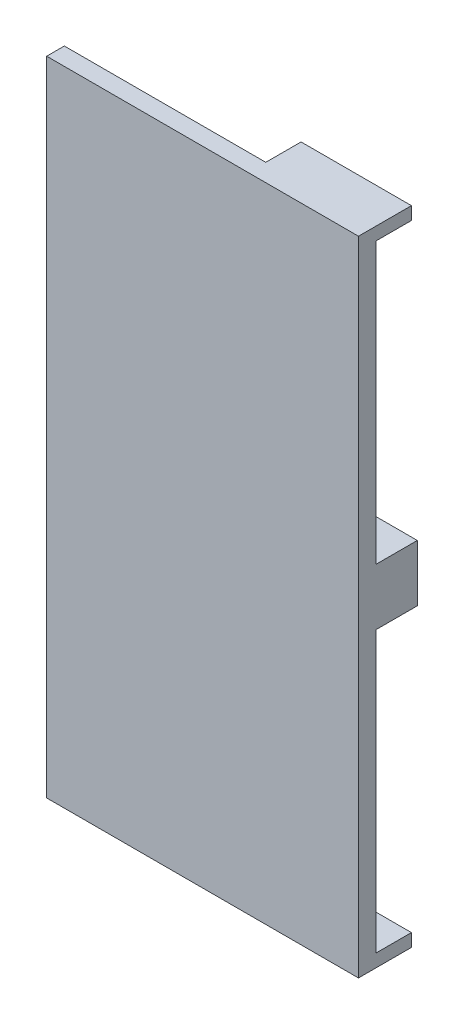
ISO-10303-21;
HEADER;
FILE_DESCRIPTION(('STEP AP214'),'2;1');
FILE_NAME('part.step','',(''),(''),'','','');
FILE_SCHEMA(('AUTOMOTIVE_DESIGN { 1 0 10303 214 1 1 1 1 }'));
ENDSEC;
DATA;
#1=APPLICATION_CONTEXT('core data for automotive mechanical design processes');
#2=APPLICATION_PROTOCOL_DEFINITION('international standard','automotive_design',2000,#1);
#3=PRODUCT_CONTEXT('',#1,'mechanical');
#4=PRODUCT('Part','Part','',(#3));
#5=PRODUCT_RELATED_PRODUCT_CATEGORY('part','',(#4));
#6=PRODUCT_DEFINITION_FORMATION('','',#4);
#7=PRODUCT_DEFINITION_CONTEXT('part definition',#1,'design');
#8=PRODUCT_DEFINITION('design','',#6,#7);
#9=PRODUCT_DEFINITION_SHAPE('','',#8);
#10=(LENGTH_UNIT() NAMED_UNIT(*) SI_UNIT(.MILLI.,.METRE.));
#11=(NAMED_UNIT(*) PLANE_ANGLE_UNIT() SI_UNIT($,.RADIAN.));
#12=(NAMED_UNIT(*) SI_UNIT($,.STERADIAN.) SOLID_ANGLE_UNIT());
#13=UNCERTAINTY_MEASURE_WITH_UNIT(LENGTH_MEASURE(1.E-05),#10,'distance_accuracy_value','');
#14=(GEOMETRIC_REPRESENTATION_CONTEXT(3) GLOBAL_UNCERTAINTY_ASSIGNED_CONTEXT((#13)) GLOBAL_UNIT_ASSIGNED_CONTEXT((#10,
#11,#12)) REPRESENTATION_CONTEXT('',''));
#15=CARTESIAN_POINT('',(0.,0.,0.));
#16=DIRECTION('',(0.,0.,1.));
#17=DIRECTION('',(1.,0.,0.));
#18=AXIS2_PLACEMENT_3D('',#15,#16,#17);
#19=CARTESIAN_POINT('',(0.,0.,0.));
#20=DIRECTION('',(0.,0.,1.));
#21=DIRECTION('',(1.,0.,0.));
#22=AXIS2_PLACEMENT_3D('',#19,#20,#21);
#23=PLANE('',#22);
#24=DIRECTION('',(-1.,0.,0.));
#25=VECTOR('',#24,1.);
#26=CARTESIAN_POINT('',(32.7375583752302,31.5854403836247,0.));
#27=LINE('',#26,#25);
#28=CARTESIAN_POINT('',(42.2573819600676,31.5854403836247,0.));
#29=VERTEX_POINT('',#28);
#30=CARTESIAN_POINT('',(32.7375583752302,31.5854403836247,0.));
#31=VERTEX_POINT('',#30);
#32=EDGE_CURVE('E533',#29,#31,#27,.T.);
#33=ORIENTED_EDGE('',*,*,#32,.F.);
#34=DIRECTION('',(0.,1.,0.));
#35=VECTOR('',#34,1.);
#36=CARTESIAN_POINT('',(42.2573819600676,61.2919093984213,0.));
#37=LINE('',#36,#35);
#38=CARTESIAN_POINT('',(42.2573819600676,7.78544038362487,0.));
#39=VERTEX_POINT('',#38);
#40=EDGE_CURVE('E182',#39,#29,#37,.T.);
#41=ORIENTED_EDGE('',*,*,#40,.F.);
#42=DIRECTION('',(-1.,0.,0.));
#43=VECTOR('',#42,1.);
#44=CARTESIAN_POINT('',(42.2573819600676,7.78544038362487,0.));
#45=LINE('',#44,#43);
#46=CARTESIAN_POINT('',(32.8785387402206,7.78544038362487,0.));
#47=VERTEX_POINT('',#46);
#48=EDGE_CURVE('E216',#39,#47,#45,.T.);
#49=ORIENTED_EDGE('',*,*,#48,.T.);
#50=DIRECTION('',(0.,-1.,0.));
#51=VECTOR('',#50,1.);
#52=CARTESIAN_POINT('',(32.8785387402206,6.69190939842128,0.));
#53=LINE('',#52,#51);
#54=CARTESIAN_POINT('',(32.8785387402206,6.69190939842128,0.));
#55=VERTEX_POINT('',#54);
#56=EDGE_CURVE('E211',#47,#55,#53,.T.);
#57=ORIENTED_EDGE('',*,*,#56,.T.);
#58=DIRECTION('',(1.,0.,0.));
#59=VECTOR('',#58,1.);
#60=CARTESIAN_POINT('',(15.7573819600676,6.69190939842127,0.));
#61=LINE('',#60,#59);
#62=CARTESIAN_POINT('',(15.7573819600676,6.69190939842127,0.));
#63=VERTEX_POINT('',#62);
#64=EDGE_CURVE('E313',#63,#55,#61,.T.);
#65=ORIENTED_EDGE('',*,*,#64,.F.);
#66=DIRECTION('',(0.,-1.,0.));
#67=VECTOR('',#66,1.);
#68=CARTESIAN_POINT('',(15.7573819600676,61.2919093984213,0.));
#69=LINE('',#68,#67);
#70=CARTESIAN_POINT('',(15.7573819600676,27.4919093984213,0.));
#71=VERTEX_POINT('',#70);
#72=EDGE_CURVE('E274',#71,#63,#69,.T.);
#73=ORIENTED_EDGE('',*,*,#72,.F.);
#74=DIRECTION('',(-1.,0.,0.));
#75=VECTOR('',#74,1.);
#76=CARTESIAN_POINT('',(23.7285916275448,27.4919093984213,0.));
#77=LINE('',#76,#75);
#78=CARTESIAN_POINT('',(23.7285916275448,27.4919093984213,0.));
#79=VERTEX_POINT('',#78);
#80=EDGE_CURVE('E59',#79,#71,#77,.T.);
#81=ORIENTED_EDGE('',*,*,#80,.F.);
#82=DIRECTION('',(0.,-1.,0.));
#83=VECTOR('',#82,1.);
#84=CARTESIAN_POINT('',(23.7285916275448,40.4919093984213,0.));
#85=LINE('',#84,#83);
#86=CARTESIAN_POINT('',(23.7285916275448,40.4919093984213,0.));
#87=VERTEX_POINT('',#86);
#88=EDGE_CURVE('E194',#87,#79,#85,.T.);
#89=ORIENTED_EDGE('',*,*,#88,.F.);
#90=DIRECTION('',(1.,0.,0.));
#91=VECTOR('',#90,1.);
#92=CARTESIAN_POINT('',(23.7285916275448,40.4919093984213,0.));
#93=LINE('',#92,#91);
#94=CARTESIAN_POINT('',(15.7573819600676,40.4919093984213,0.));
#95=VERTEX_POINT('',#94);
#96=EDGE_CURVE('E184',#95,#87,#93,.T.);
#97=ORIENTED_EDGE('',*,*,#96,.F.);
#98=CARTESIAN_POINT('',(15.7573819600676,61.2919093984213,0.));
#99=VERTEX_POINT('',#98);
#100=EDGE_CURVE('E270',#99,#95,#69,.T.);
#101=ORIENTED_EDGE('',*,*,#100,.F.);
#102=DIRECTION('',(-1.,0.,0.));
#103=VECTOR('',#102,1.);
#104=CARTESIAN_POINT('',(42.2573819600676,61.2919093984213,0.));
#105=LINE('',#104,#103);
#106=CARTESIAN_POINT('',(32.8785387402206,61.2919093984213,0.));
#107=VERTEX_POINT('',#106);
#108=EDGE_CURVE('E261',#107,#99,#105,.T.);
#109=ORIENTED_EDGE('',*,*,#108,.F.);
#110=DIRECTION('',(0.,1.,0.));
#111=VECTOR('',#110,1.);
#112=CARTESIAN_POINT('',(32.8785387402206,61.2919093984213,0.));
#113=LINE('',#112,#111);
#114=CARTESIAN_POINT('',(32.8785387402206,60.1983784132177,0.));
#115=VERTEX_POINT('',#114);
#116=EDGE_CURVE('E240',#115,#107,#113,.T.);
#117=ORIENTED_EDGE('',*,*,#116,.F.);
#118=DIRECTION('',(-1.,0.,0.));
#119=VECTOR('',#118,1.);
#120=CARTESIAN_POINT('',(42.2573819600676,60.1983784132177,0.));
#121=LINE('',#120,#119);
#122=CARTESIAN_POINT('',(42.2573819600676,60.1983784132177,0.));
#123=VERTEX_POINT('',#122);
#124=EDGE_CURVE('E235',#123,#115,#121,.T.);
#125=ORIENTED_EDGE('',*,*,#124,.F.);
#126=CARTESIAN_POINT('',(42.2573819600676,36.3983784132179,0.));
#127=VERTEX_POINT('',#126);
#128=EDGE_CURVE('E37',#127,#123,#37,.T.);
#129=ORIENTED_EDGE('',*,*,#128,.F.);
#130=DIRECTION('',(1.,0.,0.));
#131=VECTOR('',#130,1.);
#132=CARTESIAN_POINT('',(32.7375583752302,36.3983784132179,0.));
#133=LINE('',#132,#131);
#134=CARTESIAN_POINT('',(32.7375583752302,36.3983784132179,0.));
#135=VERTEX_POINT('',#134);
#136=EDGE_CURVE('E178',#135,#127,#133,.T.);
#137=ORIENTED_EDGE('',*,*,#136,.F.);
#138=DIRECTION('',(0.,1.,0.));
#139=VECTOR('',#138,1.);
#140=CARTESIAN_POINT('',(32.7375583752302,36.3983784132179,0.));
#141=LINE('',#140,#139);
#142=EDGE_CURVE('E531',#31,#135,#141,.T.);
#143=ORIENTED_EDGE('',*,*,#142,.F.);
#144=EDGE_LOOP('',(#33,#41,#49,#57,#65,#73,#81,#89,#97,#101,#109,#117,#125,#129,#137,#143));
#145=FACE_BOUND('',#144,.T.);
#146=ADVANCED_FACE('F33',(#145),#23,.F.);
#147=CARTESIAN_POINT('',(42.2573819600676,61.2919093984213,1.5));
#148=DIRECTION('',(-1.,0.,0.));
#149=DIRECTION('',(0.,-1.,0.));
#150=AXIS2_PLACEMENT_3D('',#147,#148,#149);
#151=PLANE('',#150);
#152=DIRECTION('',(0.,0.,-1.));
#153=VECTOR('',#152,1.);
#154=CARTESIAN_POINT('',(42.2573819600676,6.69190939842127,1.5));
#155=LINE('',#154,#153);
#156=CARTESIAN_POINT('',(42.2573819600676,6.69190939842127,1.5));
#157=VERTEX_POINT('',#156);
#158=CARTESIAN_POINT('',(42.2573819600676,6.69190939842128,-3.));
#159=VERTEX_POINT('',#158);
#160=EDGE_CURVE('E310',#157,#159,#155,.T.);
#161=ORIENTED_EDGE('',*,*,#160,.T.);
#162=DIRECTION('',(0.,1.,0.));
#163=VECTOR('',#162,1.);
#164=CARTESIAN_POINT('',(42.2573819600676,6.69190939842128,-3.));
#165=LINE('',#164,#163);
#166=CARTESIAN_POINT('',(42.2573819600676,7.78544038362487,-3.));
#167=VERTEX_POINT('',#166);
#168=EDGE_CURVE('E212',#159,#167,#165,.T.);
#169=ORIENTED_EDGE('',*,*,#168,.T.);
#170=DIRECTION('',(0.,0.,1.));
#171=VECTOR('',#170,1.);
#172=CARTESIAN_POINT('',(42.2573819600676,7.78544038362487,-3.));
#173=LINE('',#172,#171);
#174=EDGE_CURVE('E225',#167,#39,#173,.T.);
#175=ORIENTED_EDGE('',*,*,#174,.T.);
#176=ORIENTED_EDGE('',*,*,#40,.T.);
#177=DIRECTION('',(0.,0.,1.));
#178=VECTOR('',#177,1.);
#179=CARTESIAN_POINT('',(42.2573819600676,31.5854403836247,-3.5));
#180=LINE('',#179,#178);
#181=CARTESIAN_POINT('',(42.2573819600676,31.5854403836247,-3.5));
#182=VERTEX_POINT('',#181);
#183=EDGE_CURVE('E166',#182,#29,#180,.T.);
#184=ORIENTED_EDGE('',*,*,#183,.F.);
#185=DIRECTION('',(0.,-1.,0.));
#186=VECTOR('',#185,1.);
#187=CARTESIAN_POINT('',(42.2573819600676,36.3983784132179,-3.5));
#188=LINE('',#187,#186);
#189=CARTESIAN_POINT('',(42.2573819600676,36.3983784132179,-3.5));
#190=VERTEX_POINT('',#189);
#191=EDGE_CURVE('E173',#190,#182,#188,.T.);
#192=ORIENTED_EDGE('',*,*,#191,.F.);
#193=DIRECTION('',(0.,0.,1.));
#194=VECTOR('',#193,1.);
#195=CARTESIAN_POINT('',(42.2573819600676,36.3983784132179,-3.5));
#196=LINE('',#195,#194);
#197=EDGE_CURVE('E51',#190,#127,#196,.T.);
#198=ORIENTED_EDGE('',*,*,#197,.T.);
#199=ORIENTED_EDGE('',*,*,#128,.T.);
#200=DIRECTION('',(0.,0.,1.));
#201=VECTOR('',#200,1.);
#202=CARTESIAN_POINT('',(42.2573819600676,60.1983784132177,-3.));
#203=LINE('',#202,#201);
#204=CARTESIAN_POINT('',(42.2573819600676,60.1983784132177,-3.));
#205=VERTEX_POINT('',#204);
#206=EDGE_CURVE('E279',#205,#123,#203,.T.);
#207=ORIENTED_EDGE('',*,*,#206,.F.);
#208=DIRECTION('',(0.,-1.,0.));
#209=VECTOR('',#208,1.);
#210=CARTESIAN_POINT('',(42.2573819600676,61.2919093984213,-3.));
#211=LINE('',#210,#209);
#212=CARTESIAN_POINT('',(42.2573819600676,61.2919093984213,-3.));
#213=VERTEX_POINT('',#212);
#214=EDGE_CURVE('E236',#213,#205,#211,.T.);
#215=ORIENTED_EDGE('',*,*,#214,.F.);
#216=DIRECTION('',(0.,0.,-1.));
#217=VECTOR('',#216,1.);
#218=CARTESIAN_POINT('',(42.2573819600676,61.2919093984213,1.5));
#219=LINE('',#218,#217);
#220=CARTESIAN_POINT('',(42.2573819600676,61.2919093984213,1.5));
#221=VERTEX_POINT('',#220);
#222=EDGE_CURVE('E11',#221,#213,#219,.T.);
#223=ORIENTED_EDGE('',*,*,#222,.F.);
#224=DIRECTION('',(0.,1.,0.));
#225=VECTOR('',#224,1.);
#226=CARTESIAN_POINT('',(42.2573819600676,61.2919093984213,1.5));
#227=LINE('',#226,#225);
#228=EDGE_CURVE('E315',#157,#221,#227,.T.);
#229=ORIENTED_EDGE('',*,*,#228,.F.);
#230=EDGE_LOOP('',(#161,#169,#175,#176,#184,#192,#198,#199,#207,#215,#223,#229));
#231=FACE_BOUND('',#230,.T.);
#232=ADVANCED_FACE('F35',(#231),#151,.F.);
#233=CARTESIAN_POINT('',(42.2573819600676,61.2919093984213,1.5));
#234=DIRECTION('',(0.,-1.,0.));
#235=DIRECTION('',(1.,0.,0.));
#236=AXIS2_PLACEMENT_3D('',#233,#234,#235);
#237=PLANE('',#236);
#238=ORIENTED_EDGE('',*,*,#222,.T.);
#239=DIRECTION('',(1.,0.,0.));
#240=VECTOR('',#239,1.);
#241=CARTESIAN_POINT('',(42.2573819600676,61.2919093984213,-3.));
#242=LINE('',#241,#240);
#243=CARTESIAN_POINT('',(32.8785387402206,61.2919093984213,-3.));
#244=VERTEX_POINT('',#243);
#245=EDGE_CURVE('E244',#244,#213,#242,.T.);
#246=ORIENTED_EDGE('',*,*,#245,.F.);
#247=DIRECTION('',(0.,0.,1.));
#248=VECTOR('',#247,1.);
#249=CARTESIAN_POINT('',(32.8785387402206,61.2919093984213,-3.));
#250=LINE('',#249,#248);
#251=EDGE_CURVE('E247',#244,#107,#250,.T.);
#252=ORIENTED_EDGE('',*,*,#251,.T.);
#253=ORIENTED_EDGE('',*,*,#108,.T.);
#254=DIRECTION('',(0.,0.,-1.));
#255=VECTOR('',#254,1.);
#256=CARTESIAN_POINT('',(15.7573819600676,61.2919093984213,1.5));
#257=LINE('',#256,#255);
#258=CARTESIAN_POINT('',(15.7573819600676,61.2919093984213,1.5));
#259=VERTEX_POINT('',#258);
#260=EDGE_CURVE('E43',#259,#99,#257,.T.);
#261=ORIENTED_EDGE('',*,*,#260,.F.);
#262=DIRECTION('',(-1.,0.,0.));
#263=VECTOR('',#262,1.);
#264=CARTESIAN_POINT('',(42.2573819600676,61.2919093984213,1.5));
#265=LINE('',#264,#263);
#266=EDGE_CURVE('E319',#221,#259,#265,.T.);
#267=ORIENTED_EDGE('',*,*,#266,.F.);
#268=EDGE_LOOP('',(#238,#246,#252,#253,#261,#267));
#269=FACE_BOUND('',#268,.T.);
#270=ADVANCED_FACE('F300',(#269),#237,.F.);
#271=CARTESIAN_POINT('',(15.7573819600676,61.2919093984213,1.5));
#272=DIRECTION('',(1.,0.,0.));
#273=DIRECTION('',(0.,1.,0.));
#274=AXIS2_PLACEMENT_3D('',#271,#272,#273);
#275=PLANE('',#274);
#276=ORIENTED_EDGE('',*,*,#100,.T.);
#277=DIRECTION('',(0.,0.,1.));
#278=VECTOR('',#277,1.);
#279=CARTESIAN_POINT('',(15.7573819600676,40.4919093984213,-3.5));
#280=LINE('',#279,#278);
#281=CARTESIAN_POINT('',(15.7573819600676,40.4919093984213,-3.5));
#282=VERTEX_POINT('',#281);
#283=EDGE_CURVE('E207',#282,#95,#280,.T.);
#284=ORIENTED_EDGE('',*,*,#283,.F.);
#285=DIRECTION('',(0.,1.,0.));
#286=VECTOR('',#285,1.);
#287=CARTESIAN_POINT('',(15.7573819600676,27.4919093984213,-3.5));
#288=LINE('',#287,#286);
#289=CARTESIAN_POINT('',(15.7573819600676,27.4919093984213,-3.5));
#290=VERTEX_POINT('',#289);
#291=EDGE_CURVE('E193',#290,#282,#288,.T.);
#292=ORIENTED_EDGE('',*,*,#291,.F.);
#293=DIRECTION('',(0.,0.,1.));
#294=VECTOR('',#293,1.);
#295=CARTESIAN_POINT('',(15.7573819600676,27.4919093984213,-3.5));
#296=LINE('',#295,#294);
#297=EDGE_CURVE('E209',#290,#71,#296,.T.);
#298=ORIENTED_EDGE('',*,*,#297,.T.);
#299=ORIENTED_EDGE('',*,*,#72,.T.);
#300=DIRECTION('',(0.,0.,-1.));
#301=VECTOR('',#300,1.);
#302=CARTESIAN_POINT('',(15.7573819600676,6.69190939842127,1.5));
#303=LINE('',#302,#301);
#304=CARTESIAN_POINT('',(15.7573819600676,6.69190939842127,1.5));
#305=VERTEX_POINT('',#304);
#306=EDGE_CURVE('E308',#305,#63,#303,.T.);
#307=ORIENTED_EDGE('',*,*,#306,.F.);
#308=DIRECTION('',(0.,-1.,0.));
#309=VECTOR('',#308,1.);
#310=CARTESIAN_POINT('',(15.7573819600676,61.2919093984213,1.5));
#311=LINE('',#310,#309);
#312=EDGE_CURVE('E307',#259,#305,#311,.T.);
#313=ORIENTED_EDGE('',*,*,#312,.F.);
#314=ORIENTED_EDGE('',*,*,#260,.T.);
#315=EDGE_LOOP('',(#276,#284,#292,#298,#299,#307,#313,#314));
#316=FACE_BOUND('',#315,.T.);
#317=ADVANCED_FACE('F304',(#316),#275,.F.);
#318=CARTESIAN_POINT('',(15.7573819600676,6.69190939842127,1.5));
#319=DIRECTION('',(0.,1.,0.));
#320=DIRECTION('',(-1.,0.,0.));
#321=AXIS2_PLACEMENT_3D('',#318,#319,#320);
#322=PLANE('',#321);
#323=ORIENTED_EDGE('',*,*,#64,.T.);
#324=DIRECTION('',(0.,0.,1.));
#325=VECTOR('',#324,1.);
#326=CARTESIAN_POINT('',(32.8785387402206,6.69190939842128,-3.));
#327=LINE('',#326,#325);
#328=CARTESIAN_POINT('',(32.8785387402206,6.69190939842128,-3.));
#329=VERTEX_POINT('',#328);
#330=EDGE_CURVE('E233',#329,#55,#327,.T.);
#331=ORIENTED_EDGE('',*,*,#330,.F.);
#332=DIRECTION('',(1.,0.,0.));
#333=VECTOR('',#332,1.);
#334=CARTESIAN_POINT('',(42.2573819600676,6.69190939842128,-3.));
#335=LINE('',#334,#333);
#336=EDGE_CURVE('E215',#329,#159,#335,.T.);
#337=ORIENTED_EDGE('',*,*,#336,.T.);
#338=ORIENTED_EDGE('',*,*,#160,.F.);
#339=DIRECTION('',(1.,0.,0.));
#340=VECTOR('',#339,1.);
#341=CARTESIAN_POINT('',(15.7573819600676,6.69190939842127,1.5));
#342=LINE('',#341,#340);
#343=EDGE_CURVE('E265',#305,#157,#342,.T.);
#344=ORIENTED_EDGE('',*,*,#343,.F.);
#345=ORIENTED_EDGE('',*,*,#306,.T.);
#346=EDGE_LOOP('',(#323,#331,#337,#338,#344,#345));
#347=FACE_BOUND('',#346,.T.);
#348=ADVANCED_FACE('F322',(#347),#322,.F.);
#349=CARTESIAN_POINT('',(0.,0.,1.5));
#350=DIRECTION('',(0.,0.,1.));
#351=DIRECTION('',(1.,0.,0.));
#352=AXIS2_PLACEMENT_3D('',#349,#350,#351);
#353=PLANE('',#352);
#354=ORIENTED_EDGE('',*,*,#228,.T.);
#355=ORIENTED_EDGE('',*,*,#266,.T.);
#356=ORIENTED_EDGE('',*,*,#312,.T.);
#357=ORIENTED_EDGE('',*,*,#343,.T.);
#358=EDGE_LOOP('',(#354,#355,#356,#357));
#359=FACE_BOUND('',#358,.T.);
#360=ADVANCED_FACE('F338',(#359),#353,.T.);
#361=CARTESIAN_POINT('',(42.2573819600676,60.1983784132177,-3.));
#362=DIRECTION('',(0.,1.,0.));
#363=DIRECTION('',(0.,0.,1.));
#364=AXIS2_PLACEMENT_3D('',#361,#362,#363);
#365=PLANE('',#364);
#366=ORIENTED_EDGE('',*,*,#124,.T.);
#367=DIRECTION('',(0.,0.,1.));
#368=VECTOR('',#367,1.);
#369=CARTESIAN_POINT('',(32.8785387402206,60.1983784132177,-3.));
#370=LINE('',#369,#368);
#371=CARTESIAN_POINT('',(32.8785387402206,60.1983784132177,-3.));
#372=VERTEX_POINT('',#371);
#373=EDGE_CURVE('E250',#372,#115,#370,.T.);
#374=ORIENTED_EDGE('',*,*,#373,.F.);
#375=DIRECTION('',(-1.,0.,0.));
#376=VECTOR('',#375,1.);
#377=CARTESIAN_POINT('',(42.2573819600676,60.1983784132177,-3.));
#378=LINE('',#377,#376);
#379=EDGE_CURVE('E239',#205,#372,#378,.T.);
#380=ORIENTED_EDGE('',*,*,#379,.F.);
#381=ORIENTED_EDGE('',*,*,#206,.T.);
#382=EDGE_LOOP('',(#366,#374,#380,#381));
#383=FACE_BOUND('',#382,.T.);
#384=ADVANCED_FACE('F289',(#383),#365,.F.);
#385=CARTESIAN_POINT('',(32.8785387402206,61.2919093984213,-3.));
#386=DIRECTION('',(1.,0.,0.));
#387=DIRECTION('',(0.,0.,-1.));
#388=AXIS2_PLACEMENT_3D('',#385,#386,#387);
#389=PLANE('',#388);
#390=ORIENTED_EDGE('',*,*,#116,.T.);
#391=ORIENTED_EDGE('',*,*,#251,.F.);
#392=DIRECTION('',(0.,1.,0.));
#393=VECTOR('',#392,1.);
#394=CARTESIAN_POINT('',(32.8785387402206,61.2919093984213,-3.));
#395=LINE('',#394,#393);
#396=EDGE_CURVE('E242',#372,#244,#395,.T.);
#397=ORIENTED_EDGE('',*,*,#396,.F.);
#398=ORIENTED_EDGE('',*,*,#373,.T.);
#399=EDGE_LOOP('',(#390,#391,#397,#398));
#400=FACE_BOUND('',#399,.T.);
#401=ADVANCED_FACE('F287',(#400),#389,.F.);
#402=CARTESIAN_POINT('',(0.,0.,-3.));
#403=DIRECTION('',(0.,0.,-1.));
#404=DIRECTION('',(-1.,0.,0.));
#405=AXIS2_PLACEMENT_3D('',#402,#403,#404);
#406=PLANE('',#405);
#407=ORIENTED_EDGE('',*,*,#214,.T.);
#408=ORIENTED_EDGE('',*,*,#379,.T.);
#409=ORIENTED_EDGE('',*,*,#396,.T.);
#410=ORIENTED_EDGE('',*,*,#245,.T.);
#411=EDGE_LOOP('',(#407,#408,#409,#410));
#412=FACE_BOUND('',#411,.T.);
#413=ADVANCED_FACE('F341',(#412),#406,.T.);
#414=CARTESIAN_POINT('',(32.8785387402206,6.69190939842128,-3.));
#415=DIRECTION('',(-1.,0.,0.));
#416=DIRECTION('',(0.,-1.,0.));
#417=AXIS2_PLACEMENT_3D('',#414,#415,#416);
#418=PLANE('',#417);
#419=ORIENTED_EDGE('',*,*,#56,.F.);
#420=DIRECTION('',(0.,0.,1.));
#421=VECTOR('',#420,1.);
#422=CARTESIAN_POINT('',(32.8785387402206,7.78544038362487,-3.));
#423=LINE('',#422,#421);
#424=CARTESIAN_POINT('',(32.8785387402206,7.78544038362487,-3.));
#425=VERTEX_POINT('',#424);
#426=EDGE_CURVE('E231',#425,#47,#423,.T.);
#427=ORIENTED_EDGE('',*,*,#426,.F.);
#428=DIRECTION('',(0.,-1.,0.));
#429=VECTOR('',#428,1.);
#430=CARTESIAN_POINT('',(32.8785387402206,6.69190939842128,-3.));
#431=LINE('',#430,#429);
#432=EDGE_CURVE('E219',#425,#329,#431,.T.);
#433=ORIENTED_EDGE('',*,*,#432,.T.);
#434=ORIENTED_EDGE('',*,*,#330,.T.);
#435=EDGE_LOOP('',(#419,#427,#433,#434));
#436=FACE_BOUND('',#435,.T.);
#437=ADVANCED_FACE('F327',(#436),#418,.T.);
#438=CARTESIAN_POINT('',(42.2573819600676,7.78544038362487,-3.));
#439=DIRECTION('',(0.,1.,0.));
#440=DIRECTION('',(-1.,0.,0.));
#441=AXIS2_PLACEMENT_3D('',#438,#439,#440);
#442=PLANE('',#441);
#443=ORIENTED_EDGE('',*,*,#48,.F.);
#444=ORIENTED_EDGE('',*,*,#174,.F.);
#445=DIRECTION('',(-1.,0.,0.));
#446=VECTOR('',#445,1.);
#447=CARTESIAN_POINT('',(42.2573819600676,7.78544038362487,-3.));
#448=LINE('',#447,#446);
#449=EDGE_CURVE('E222',#167,#425,#448,.T.);
#450=ORIENTED_EDGE('',*,*,#449,.T.);
#451=ORIENTED_EDGE('',*,*,#426,.T.);
#452=EDGE_LOOP('',(#443,#444,#450,#451));
#453=FACE_BOUND('',#452,.T.);
#454=ADVANCED_FACE('F348',(#453),#442,.T.);
#455=CARTESIAN_POINT('',(0.,67.9838187968426,-3.));
#456=DIRECTION('',(0.,0.,-1.));
#457=DIRECTION('',(-1.,0.,0.));
#458=AXIS2_PLACEMENT_3D('',#455,#456,#457);
#459=PLANE('',#458);
#460=ORIENTED_EDGE('',*,*,#168,.F.);
#461=ORIENTED_EDGE('',*,*,#336,.F.);
#462=ORIENTED_EDGE('',*,*,#432,.F.);
#463=ORIENTED_EDGE('',*,*,#449,.F.);
#464=EDGE_LOOP('',(#460,#461,#462,#463));
#465=FACE_BOUND('',#464,.T.);
#466=ADVANCED_FACE('F332',(#465),#459,.T.);
#467=CARTESIAN_POINT('',(23.7285916275448,27.4919093984213,-3.5));
#468=DIRECTION('',(0.,1.,0.));
#469=DIRECTION('',(0.,0.,1.));
#470=AXIS2_PLACEMENT_3D('',#467,#468,#469);
#471=PLANE('',#470);
#472=ORIENTED_EDGE('',*,*,#80,.T.);
#473=ORIENTED_EDGE('',*,*,#297,.F.);
#474=DIRECTION('',(-1.,0.,0.));
#475=VECTOR('',#474,1.);
#476=CARTESIAN_POINT('',(23.7285916275448,27.4919093984213,-3.5));
#477=LINE('',#476,#475);
#478=CARTESIAN_POINT('',(23.7285916275448,27.4919093984213,-3.5));
#479=VERTEX_POINT('',#478);
#480=EDGE_CURVE('E190',#479,#290,#477,.T.);
#481=ORIENTED_EDGE('',*,*,#480,.F.);
#482=DIRECTION('',(0.,0.,1.));
#483=VECTOR('',#482,1.);
#484=CARTESIAN_POINT('',(23.7285916275448,27.4919093984213,-3.5));
#485=LINE('',#484,#483);
#486=EDGE_CURVE('E199',#479,#79,#485,.T.);
#487=ORIENTED_EDGE('',*,*,#486,.T.);
#488=EDGE_LOOP('',(#472,#473,#481,#487));
#489=FACE_BOUND('',#488,.T.);
#490=ADVANCED_FACE('F433',(#489),#471,.F.);
#491=CARTESIAN_POINT('',(23.7285916275448,40.4919093984213,-3.5));
#492=DIRECTION('',(0.,-1.,0.));
#493=DIRECTION('',(0.,0.,-1.));
#494=AXIS2_PLACEMENT_3D('',#491,#492,#493);
#495=PLANE('',#494);
#496=ORIENTED_EDGE('',*,*,#96,.T.);
#497=DIRECTION('',(0.,0.,1.));
#498=VECTOR('',#497,1.);
#499=CARTESIAN_POINT('',(23.7285916275448,40.4919093984213,-3.5));
#500=LINE('',#499,#498);
#501=CARTESIAN_POINT('',(23.7285916275448,40.4919093984213,-3.5));
#502=VERTEX_POINT('',#501);
#503=EDGE_CURVE('E204',#502,#87,#500,.T.);
#504=ORIENTED_EDGE('',*,*,#503,.F.);
#505=DIRECTION('',(1.,0.,0.));
#506=VECTOR('',#505,1.);
#507=CARTESIAN_POINT('',(23.7285916275448,40.4919093984213,-3.5));
#508=LINE('',#507,#506);
#509=EDGE_CURVE('E196',#282,#502,#508,.T.);
#510=ORIENTED_EDGE('',*,*,#509,.F.);
#511=ORIENTED_EDGE('',*,*,#283,.T.);
#512=EDGE_LOOP('',(#496,#504,#510,#511));
#513=FACE_BOUND('',#512,.T.);
#514=ADVANCED_FACE('F445',(#513),#495,.F.);
#515=CARTESIAN_POINT('',(23.7285916275448,40.4919093984213,-3.5));
#516=DIRECTION('',(-1.,0.,0.));
#517=DIRECTION('',(0.,-1.,0.));
#518=AXIS2_PLACEMENT_3D('',#515,#516,#517);
#519=PLANE('',#518);
#520=ORIENTED_EDGE('',*,*,#88,.T.);
#521=ORIENTED_EDGE('',*,*,#486,.F.);
#522=DIRECTION('',(0.,-1.,0.));
#523=VECTOR('',#522,1.);
#524=CARTESIAN_POINT('',(23.7285916275448,40.4919093984213,-3.5));
#525=LINE('',#524,#523);
#526=EDGE_CURVE('E198',#502,#479,#525,.T.);
#527=ORIENTED_EDGE('',*,*,#526,.F.);
#528=ORIENTED_EDGE('',*,*,#503,.T.);
#529=EDGE_LOOP('',(#520,#521,#527,#528));
#530=FACE_BOUND('',#529,.T.);
#531=ADVANCED_FACE('F452',(#530),#519,.F.);
#532=CARTESIAN_POINT('',(0.,0.,-3.5));
#533=DIRECTION('',(0.,0.,-1.));
#534=DIRECTION('',(-1.,0.,0.));
#535=AXIS2_PLACEMENT_3D('',#532,#533,#534);
#536=PLANE('',#535);
#537=ORIENTED_EDGE('',*,*,#480,.T.);
#538=ORIENTED_EDGE('',*,*,#291,.T.);
#539=ORIENTED_EDGE('',*,*,#509,.T.);
#540=ORIENTED_EDGE('',*,*,#526,.T.);
#541=EDGE_LOOP('',(#537,#538,#539,#540));
#542=FACE_BOUND('',#541,.T.);
#543=ADVANCED_FACE('F460',(#542),#536,.T.);
#544=CARTESIAN_POINT('',(32.7375583752302,31.5854403836247,-3.5));
#545=DIRECTION('',(0.,1.,0.));
#546=DIRECTION('',(0.,0.,1.));
#547=AXIS2_PLACEMENT_3D('',#544,#545,#546);
#548=PLANE('',#547);
#549=ORIENTED_EDGE('',*,*,#32,.T.);
#550=DIRECTION('',(0.,0.,1.));
#551=VECTOR('',#550,1.);
#552=CARTESIAN_POINT('',(32.7375583752302,31.5854403836247,-3.5));
#553=LINE('',#552,#551);
#554=CARTESIAN_POINT('',(32.7375583752302,31.5854403836247,-3.5));
#555=VERTEX_POINT('',#554);
#556=EDGE_CURVE('E169',#555,#31,#553,.T.);
#557=ORIENTED_EDGE('',*,*,#556,.F.);
#558=DIRECTION('',(-1.,0.,0.));
#559=VECTOR('',#558,1.);
#560=CARTESIAN_POINT('',(32.7375583752302,31.5854403836247,-3.5));
#561=LINE('',#560,#559);
#562=EDGE_CURVE('E162',#182,#555,#561,.T.);
#563=ORIENTED_EDGE('',*,*,#562,.F.);
#564=ORIENTED_EDGE('',*,*,#183,.T.);
#565=EDGE_LOOP('',(#549,#557,#563,#564));
#566=FACE_BOUND('',#565,.T.);
#567=ADVANCED_FACE('F164',(#566),#548,.F.);
#568=CARTESIAN_POINT('',(32.7375583752302,36.3983784132179,-3.5));
#569=DIRECTION('',(1.,0.,0.));
#570=DIRECTION('',(0.,0.,-1.));
#571=AXIS2_PLACEMENT_3D('',#568,#569,#570);
#572=PLANE('',#571);
#573=ORIENTED_EDGE('',*,*,#142,.T.);
#574=DIRECTION('',(0.,0.,1.));
#575=VECTOR('',#574,1.);
#576=CARTESIAN_POINT('',(32.7375583752302,36.3983784132179,-3.5));
#577=LINE('',#576,#575);
#578=CARTESIAN_POINT('',(32.7375583752302,36.3983784132179,-3.5));
#579=VERTEX_POINT('',#578);
#580=EDGE_CURVE('E186',#579,#135,#577,.T.);
#581=ORIENTED_EDGE('',*,*,#580,.F.);
#582=DIRECTION('',(0.,1.,0.));
#583=VECTOR('',#582,1.);
#584=CARTESIAN_POINT('',(32.7375583752302,36.3983784132179,-3.5));
#585=LINE('',#584,#583);
#586=EDGE_CURVE('E172',#555,#579,#585,.T.);
#587=ORIENTED_EDGE('',*,*,#586,.F.);
#588=ORIENTED_EDGE('',*,*,#556,.T.);
#589=EDGE_LOOP('',(#573,#581,#587,#588));
#590=FACE_BOUND('',#589,.T.);
#591=ADVANCED_FACE('F475',(#590),#572,.F.);
#592=CARTESIAN_POINT('',(32.7375583752302,36.3983784132179,-3.5));
#593=DIRECTION('',(0.,-1.,0.));
#594=DIRECTION('',(0.,0.,-1.));
#595=AXIS2_PLACEMENT_3D('',#592,#593,#594);
#596=PLANE('',#595);
#597=ORIENTED_EDGE('',*,*,#136,.T.);
#598=ORIENTED_EDGE('',*,*,#197,.F.);
#599=DIRECTION('',(1.,0.,0.));
#600=VECTOR('',#599,1.);
#601=CARTESIAN_POINT('',(32.7375583752302,36.3983784132179,-3.5));
#602=LINE('',#601,#600);
#603=EDGE_CURVE('E177',#579,#190,#602,.T.);
#604=ORIENTED_EDGE('',*,*,#603,.F.);
#605=ORIENTED_EDGE('',*,*,#580,.T.);
#606=EDGE_LOOP('',(#597,#598,#604,#605));
#607=FACE_BOUND('',#606,.T.);
#608=ADVANCED_FACE('F482',(#607),#596,.F.);
#609=CARTESIAN_POINT('',(0.,0.,-3.5));
#610=DIRECTION('',(0.,0.,1.));
#611=DIRECTION('',(1.,0.,0.));
#612=AXIS2_PLACEMENT_3D('',#609,#610,#611);
#613=PLANE('',#612);
#614=ORIENTED_EDGE('',*,*,#191,.T.);
#615=ORIENTED_EDGE('',*,*,#562,.T.);
#616=ORIENTED_EDGE('',*,*,#586,.T.);
#617=ORIENTED_EDGE('',*,*,#603,.T.);
#618=EDGE_LOOP('',(#614,#615,#616,#617));
#619=FACE_BOUND('',#618,.T.);
#620=ADVANCED_FACE('F175',(#619),#613,.F.);
#621=CLOSED_SHELL('',(#146,#232,#270,#317,#348,#360,#384,#401,#413,#437,#454,#466,#490,#514,
#531,#543,#567,#591,#608,#620));
#622=MANIFOLD_SOLID_BREP('B2',#621);
#623=ADVANCED_BREP_SHAPE_REPRESENTATION('',(#18,#622),#14);
#624=SHAPE_DEFINITION_REPRESENTATION(#9,#623);
ENDSEC;
END-ISO-10303-21;
